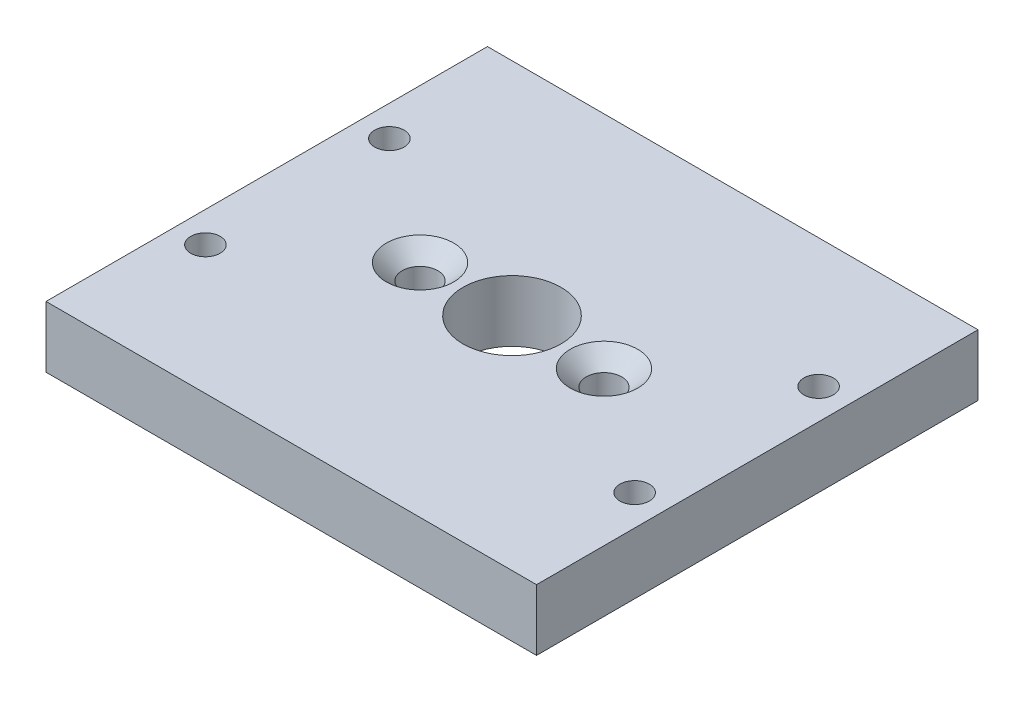
ISO-10303-21;
HEADER;
FILE_DESCRIPTION(('STEP AP214'),'2;1');
FILE_NAME('part.step','',(''),(''),'','','');
FILE_SCHEMA(('AUTOMOTIVE_DESIGN { 1 0 10303 214 1 1 1 1 }'));
ENDSEC;
DATA;
#1=APPLICATION_CONTEXT('core data for automotive mechanical design processes');
#2=APPLICATION_PROTOCOL_DEFINITION('international standard','automotive_design',2000,#1);
#3=PRODUCT_CONTEXT('',#1,'mechanical');
#4=PRODUCT('Part','Part','',(#3));
#5=PRODUCT_RELATED_PRODUCT_CATEGORY('part','',(#4));
#6=PRODUCT_DEFINITION_FORMATION('','',#4);
#7=PRODUCT_DEFINITION_CONTEXT('part definition',#1,'design');
#8=PRODUCT_DEFINITION('design','',#6,#7);
#9=PRODUCT_DEFINITION_SHAPE('','',#8);
#10=(LENGTH_UNIT() NAMED_UNIT(*) SI_UNIT(.MILLI.,.METRE.));
#11=(NAMED_UNIT(*) PLANE_ANGLE_UNIT() SI_UNIT($,.RADIAN.));
#12=(NAMED_UNIT(*) SI_UNIT($,.STERADIAN.) SOLID_ANGLE_UNIT());
#13=UNCERTAINTY_MEASURE_WITH_UNIT(LENGTH_MEASURE(1.E-05),#10,'distance_accuracy_value','');
#14=(GEOMETRIC_REPRESENTATION_CONTEXT(3) GLOBAL_UNCERTAINTY_ASSIGNED_CONTEXT((#13)) GLOBAL_UNIT_ASSIGNED_CONTEXT((#10,
#11,#12)) REPRESENTATION_CONTEXT('',''));
#15=CARTESIAN_POINT('',(0.,0.,0.));
#16=DIRECTION('',(0.,0.,1.));
#17=DIRECTION('',(1.,0.,0.));
#18=AXIS2_PLACEMENT_3D('',#15,#16,#17);
#19=CARTESIAN_POINT('',(0.,0.,0.));
#20=DIRECTION('',(0.,1.,0.));
#21=DIRECTION('',(0.,0.,1.));
#22=AXIS2_PLACEMENT_3D('',#19,#20,#21);
#23=PLANE('',#22);
#24=CARTESIAN_POINT('',(17.5,0.,7.5));
#25=DIRECTION('',(0.,-1.,0.));
#26=DIRECTION('',(0.,0.,-1.));
#27=AXIS2_PLACEMENT_3D('',#24,#25,#26);
#28=CIRCLE('',#27,2.2);
#29=CARTESIAN_POINT('',(17.5,0.,5.3));
#30=VERTEX_POINT('',#29);
#31=EDGE_CURVE('E168',#30,#30,#28,.T.);
#32=ORIENTED_EDGE('',*,*,#31,.F.);
#33=EDGE_LOOP('',(#32));
#34=FACE_BOUND('',#33,.T.);
#35=CARTESIAN_POINT('',(-7.5,0.,0.));
#36=DIRECTION('',(0.,1.,0.));
#37=DIRECTION('',(0.,0.,1.));
#38=AXIS2_PLACEMENT_3D('',#35,#36,#37);
#39=CIRCLE('',#38,1.45);
#40=CARTESIAN_POINT('',(-7.5,0.,1.45));
#41=VERTEX_POINT('',#40);
#42=EDGE_CURVE('E148',#41,#41,#39,.T.);
#43=ORIENTED_EDGE('',*,*,#42,.T.);
#44=EDGE_LOOP('',(#43));
#45=FACE_BOUND('',#44,.T.);
#46=CARTESIAN_POINT('',(7.5,0.,0.));
#47=DIRECTION('',(0.,1.,0.));
#48=DIRECTION('',(0.,0.,1.));
#49=AXIS2_PLACEMENT_3D('',#46,#47,#48);
#50=CIRCLE('',#49,1.45);
#51=CARTESIAN_POINT('',(7.5,0.,1.45));
#52=VERTEX_POINT('',#51);
#53=EDGE_CURVE('E133',#52,#52,#50,.T.);
#54=ORIENTED_EDGE('',*,*,#53,.T.);
#55=EDGE_LOOP('',(#54));
#56=FACE_BOUND('',#55,.T.);
#57=CARTESIAN_POINT('',(0.,0.,0.));
#58=DIRECTION('',(0.,1.,0.));
#59=DIRECTION('',(0.,0.,1.));
#60=AXIS2_PLACEMENT_3D('',#57,#58,#59);
#61=CIRCLE('',#60,4.);
#62=CARTESIAN_POINT('',(0.,0.,4.));
#63=VERTEX_POINT('',#62);
#64=EDGE_CURVE('E112',#63,#63,#61,.T.);
#65=ORIENTED_EDGE('',*,*,#64,.T.);
#66=EDGE_LOOP('',(#65));
#67=FACE_BOUND('',#66,.T.);
#68=DIRECTION('',(0.,0.,1.));
#69=VECTOR('',#68,1.);
#70=CARTESIAN_POINT('',(-20.,0.,18.));
#71=LINE('',#70,#69);
#72=CARTESIAN_POINT('',(-20.,0.,-18.));
#73=VERTEX_POINT('',#72);
#74=CARTESIAN_POINT('',(-20.,0.,18.));
#75=VERTEX_POINT('',#74);
#76=EDGE_CURVE('E108',#73,#75,#71,.T.);
#77=ORIENTED_EDGE('',*,*,#76,.F.);
#78=DIRECTION('',(-1.,0.,0.));
#79=VECTOR('',#78,1.);
#80=CARTESIAN_POINT('',(20.,0.,-18.));
#81=LINE('',#80,#79);
#82=CARTESIAN_POINT('',(20.,0.,-18.));
#83=VERTEX_POINT('',#82);
#84=EDGE_CURVE('E80',#83,#73,#81,.T.);
#85=ORIENTED_EDGE('',*,*,#84,.F.);
#86=DIRECTION('',(0.,0.,-1.));
#87=VECTOR('',#86,1.);
#88=CARTESIAN_POINT('',(20.,0.,18.));
#89=LINE('',#88,#87);
#90=CARTESIAN_POINT('',(20.,0.,18.));
#91=VERTEX_POINT('',#90);
#92=EDGE_CURVE('E74',#91,#83,#89,.T.);
#93=ORIENTED_EDGE('',*,*,#92,.F.);
#94=DIRECTION('',(1.,0.,0.));
#95=VECTOR('',#94,1.);
#96=CARTESIAN_POINT('',(20.,0.,18.));
#97=LINE('',#96,#95);
#98=EDGE_CURVE('E97',#75,#91,#97,.T.);
#99=ORIENTED_EDGE('',*,*,#98,.F.);
#100=EDGE_LOOP('',(#77,#85,#93,#99));
#101=FACE_BOUND('',#100,.T.);
#102=CARTESIAN_POINT('',(17.5,0.,-7.5));
#103=DIRECTION('',(0.,-1.,0.));
#104=DIRECTION('',(0.,0.,-1.));
#105=AXIS2_PLACEMENT_3D('',#102,#103,#104);
#106=CIRCLE('',#105,2.2);
#107=CARTESIAN_POINT('',(17.5,0.,-9.7));
#108=VERTEX_POINT('',#107);
#109=EDGE_CURVE('E180',#108,#108,#106,.T.);
#110=ORIENTED_EDGE('',*,*,#109,.F.);
#111=EDGE_LOOP('',(#110));
#112=FACE_BOUND('',#111,.T.);
#113=CARTESIAN_POINT('',(-17.5,0.,-7.5));
#114=DIRECTION('',(0.,-1.,0.));
#115=DIRECTION('',(0.,0.,-1.));
#116=AXIS2_PLACEMENT_3D('',#113,#114,#115);
#117=CIRCLE('',#116,2.2);
#118=CARTESIAN_POINT('',(-17.5,0.,-9.7));
#119=VERTEX_POINT('',#118);
#120=EDGE_CURVE('E192',#119,#119,#117,.T.);
#121=ORIENTED_EDGE('',*,*,#120,.F.);
#122=EDGE_LOOP('',(#121));
#123=FACE_BOUND('',#122,.T.);
#124=CARTESIAN_POINT('',(-17.5,0.,7.5));
#125=DIRECTION('',(0.,-1.,0.));
#126=DIRECTION('',(0.,0.,-1.));
#127=AXIS2_PLACEMENT_3D('',#124,#125,#126);
#128=CIRCLE('',#127,2.2);
#129=CARTESIAN_POINT('',(-17.5,0.,5.3));
#130=VERTEX_POINT('',#129);
#131=EDGE_CURVE('E204',#130,#130,#128,.T.);
#132=ORIENTED_EDGE('',*,*,#131,.F.);
#133=EDGE_LOOP('',(#132));
#134=FACE_BOUND('',#133,.T.);
#135=ADVANCED_FACE('F39',(#34,#45,#56,#67,#101,#112,#123,#134),#23,.F.);
#136=CARTESIAN_POINT('',(-20.,5.,18.));
#137=DIRECTION('',(1.,0.,0.));
#138=DIRECTION('',(0.,0.,-1.));
#139=AXIS2_PLACEMENT_3D('',#136,#137,#138);
#140=PLANE('',#139);
#141=ORIENTED_EDGE('',*,*,#76,.T.);
#142=DIRECTION('',(0.,-1.,0.));
#143=VECTOR('',#142,1.);
#144=CARTESIAN_POINT('',(-20.,5.,18.));
#145=LINE('',#144,#143);
#146=CARTESIAN_POINT('',(-20.,5.,18.));
#147=VERTEX_POINT('',#146);
#148=EDGE_CURVE('E11',#147,#75,#145,.T.);
#149=ORIENTED_EDGE('',*,*,#148,.F.);
#150=DIRECTION('',(0.,0.,1.));
#151=VECTOR('',#150,1.);
#152=CARTESIAN_POINT('',(-20.,5.,18.));
#153=LINE('',#152,#151);
#154=CARTESIAN_POINT('',(-20.,5.,-18.));
#155=VERTEX_POINT('',#154);
#156=EDGE_CURVE('E92',#155,#147,#153,.T.);
#157=ORIENTED_EDGE('',*,*,#156,.F.);
#158=DIRECTION('',(0.,-1.,0.));
#159=VECTOR('',#158,1.);
#160=CARTESIAN_POINT('',(-20.,5.,-18.));
#161=LINE('',#160,#159);
#162=EDGE_CURVE('E104',#155,#73,#161,.T.);
#163=ORIENTED_EDGE('',*,*,#162,.T.);
#164=EDGE_LOOP('',(#141,#149,#157,#163));
#165=FACE_BOUND('',#164,.T.);
#166=ADVANCED_FACE('F41',(#165),#140,.F.);
#167=CARTESIAN_POINT('',(20.,5.,18.));
#168=DIRECTION('',(0.,0.,-1.));
#169=DIRECTION('',(-1.,0.,0.));
#170=AXIS2_PLACEMENT_3D('',#167,#168,#169);
#171=PLANE('',#170);
#172=ORIENTED_EDGE('',*,*,#98,.T.);
#173=DIRECTION('',(0.,-1.,0.));
#174=VECTOR('',#173,1.);
#175=CARTESIAN_POINT('',(20.,5.,18.));
#176=LINE('',#175,#174);
#177=CARTESIAN_POINT('',(20.,5.,18.));
#178=VERTEX_POINT('',#177);
#179=EDGE_CURVE('E49',#178,#91,#176,.T.);
#180=ORIENTED_EDGE('',*,*,#179,.F.);
#181=DIRECTION('',(1.,0.,0.));
#182=VECTOR('',#181,1.);
#183=CARTESIAN_POINT('',(20.,5.,18.));
#184=LINE('',#183,#182);
#185=EDGE_CURVE('E87',#147,#178,#184,.T.);
#186=ORIENTED_EDGE('',*,*,#185,.F.);
#187=ORIENTED_EDGE('',*,*,#148,.T.);
#188=EDGE_LOOP('',(#172,#180,#186,#187));
#189=FACE_BOUND('',#188,.T.);
#190=ADVANCED_FACE('F96',(#189),#171,.F.);
#191=CARTESIAN_POINT('',(20.,5.,18.));
#192=DIRECTION('',(-1.,0.,0.));
#193=DIRECTION('',(0.,0.,1.));
#194=AXIS2_PLACEMENT_3D('',#191,#192,#193);
#195=PLANE('',#194);
#196=ORIENTED_EDGE('',*,*,#92,.T.);
#197=DIRECTION('',(0.,-1.,0.));
#198=VECTOR('',#197,1.);
#199=CARTESIAN_POINT('',(20.,5.,-18.));
#200=LINE('',#199,#198);
#201=CARTESIAN_POINT('',(20.,5.,-18.));
#202=VERTEX_POINT('',#201);
#203=EDGE_CURVE('E99',#202,#83,#200,.T.);
#204=ORIENTED_EDGE('',*,*,#203,.F.);
#205=DIRECTION('',(0.,0.,-1.));
#206=VECTOR('',#205,1.);
#207=CARTESIAN_POINT('',(20.,5.,18.));
#208=LINE('',#207,#206);
#209=EDGE_CURVE('E90',#178,#202,#208,.T.);
#210=ORIENTED_EDGE('',*,*,#209,.F.);
#211=ORIENTED_EDGE('',*,*,#179,.T.);
#212=EDGE_LOOP('',(#196,#204,#210,#211));
#213=FACE_BOUND('',#212,.T.);
#214=ADVANCED_FACE('F100',(#213),#195,.F.);
#215=CARTESIAN_POINT('',(20.,5.,-18.));
#216=DIRECTION('',(0.,0.,1.));
#217=DIRECTION('',(1.,0.,0.));
#218=AXIS2_PLACEMENT_3D('',#215,#216,#217);
#219=PLANE('',#218);
#220=ORIENTED_EDGE('',*,*,#84,.T.);
#221=ORIENTED_EDGE('',*,*,#162,.F.);
#222=DIRECTION('',(-1.,0.,0.));
#223=VECTOR('',#222,1.);
#224=CARTESIAN_POINT('',(20.,5.,-18.));
#225=LINE('',#224,#223);
#226=EDGE_CURVE('E57',#202,#155,#225,.T.);
#227=ORIENTED_EDGE('',*,*,#226,.F.);
#228=ORIENTED_EDGE('',*,*,#203,.T.);
#229=EDGE_LOOP('',(#220,#221,#227,#228));
#230=FACE_BOUND('',#229,.T.);
#231=ADVANCED_FACE('F122',(#230),#219,.F.);
#232=CARTESIAN_POINT('',(0.,5.,0.));
#233=DIRECTION('',(0.,1.,0.));
#234=DIRECTION('',(0.,0.,1.));
#235=AXIS2_PLACEMENT_3D('',#232,#233,#234);
#236=PLANE('',#235);
#237=CARTESIAN_POINT('',(-17.5,5.,7.5));
#238=DIRECTION('',(0.,1.,0.));
#239=DIRECTION('',(0.,0.,1.));
#240=AXIS2_PLACEMENT_3D('',#237,#238,#239);
#241=CIRCLE('',#240,1.2);
#242=CARTESIAN_POINT('',(-17.5,5.,8.7));
#243=VERTEX_POINT('',#242);
#244=EDGE_CURVE('E196',#243,#243,#241,.T.);
#245=ORIENTED_EDGE('',*,*,#244,.F.);
#246=EDGE_LOOP('',(#245));
#247=FACE_BOUND('',#246,.T.);
#248=CARTESIAN_POINT('',(-17.5,5.,-7.5));
#249=DIRECTION('',(0.,1.,0.));
#250=DIRECTION('',(0.,0.,1.));
#251=AXIS2_PLACEMENT_3D('',#248,#249,#250);
#252=CIRCLE('',#251,1.2);
#253=CARTESIAN_POINT('',(-17.5,5.,-6.3));
#254=VERTEX_POINT('',#253);
#255=EDGE_CURVE('E184',#254,#254,#252,.T.);
#256=ORIENTED_EDGE('',*,*,#255,.F.);
#257=EDGE_LOOP('',(#256));
#258=FACE_BOUND('',#257,.T.);
#259=CARTESIAN_POINT('',(17.5,5.,-7.5));
#260=DIRECTION('',(0.,1.,0.));
#261=DIRECTION('',(0.,0.,1.));
#262=AXIS2_PLACEMENT_3D('',#259,#260,#261);
#263=CIRCLE('',#262,1.2);
#264=CARTESIAN_POINT('',(17.5,5.,-6.3));
#265=VERTEX_POINT('',#264);
#266=EDGE_CURVE('E172',#265,#265,#263,.T.);
#267=ORIENTED_EDGE('',*,*,#266,.F.);
#268=EDGE_LOOP('',(#267));
#269=FACE_BOUND('',#268,.T.);
#270=CARTESIAN_POINT('',(17.5,5.,7.5));
#271=DIRECTION('',(0.,1.,0.));
#272=DIRECTION('',(0.,0.,1.));
#273=AXIS2_PLACEMENT_3D('',#270,#271,#272);
#274=CIRCLE('',#273,1.2);
#275=CARTESIAN_POINT('',(17.5,5.,8.7));
#276=VERTEX_POINT('',#275);
#277=EDGE_CURVE('E160',#276,#276,#274,.T.);
#278=ORIENTED_EDGE('',*,*,#277,.F.);
#279=EDGE_LOOP('',(#278));
#280=FACE_BOUND('',#279,.T.);
#281=CARTESIAN_POINT('',(-7.5,5.,0.));
#282=DIRECTION('',(0.,1.,0.));
#283=DIRECTION('',(0.,0.,1.));
#284=AXIS2_PLACEMENT_3D('',#281,#282,#283);
#285=CIRCLE('',#284,2.75);
#286=CARTESIAN_POINT('',(-7.5,5.,2.75));
#287=VERTEX_POINT('',#286);
#288=EDGE_CURVE('E156',#287,#287,#285,.T.);
#289=ORIENTED_EDGE('',*,*,#288,.F.);
#290=EDGE_LOOP('',(#289));
#291=FACE_BOUND('',#290,.T.);
#292=CARTESIAN_POINT('',(7.5,5.,0.));
#293=DIRECTION('',(0.,1.,0.));
#294=DIRECTION('',(0.,0.,1.));
#295=AXIS2_PLACEMENT_3D('',#292,#293,#294);
#296=CIRCLE('',#295,2.75);
#297=CARTESIAN_POINT('',(7.5,5.,2.75));
#298=VERTEX_POINT('',#297);
#299=EDGE_CURVE('E144',#298,#298,#296,.T.);
#300=ORIENTED_EDGE('',*,*,#299,.F.);
#301=EDGE_LOOP('',(#300));
#302=FACE_BOUND('',#301,.T.);
#303=CARTESIAN_POINT('',(0.,5.,0.));
#304=DIRECTION('',(0.,1.,0.));
#305=DIRECTION('',(0.,0.,1.));
#306=AXIS2_PLACEMENT_3D('',#303,#304,#305);
#307=CIRCLE('',#306,4.);
#308=CARTESIAN_POINT('',(0.,5.,4.));
#309=VERTEX_POINT('',#308);
#310=EDGE_CURVE('E129',#309,#309,#307,.T.);
#311=ORIENTED_EDGE('',*,*,#310,.F.);
#312=EDGE_LOOP('',(#311));
#313=FACE_BOUND('',#312,.T.);
#314=ORIENTED_EDGE('',*,*,#156,.T.);
#315=ORIENTED_EDGE('',*,*,#185,.T.);
#316=ORIENTED_EDGE('',*,*,#209,.T.);
#317=ORIENTED_EDGE('',*,*,#226,.T.);
#318=EDGE_LOOP('',(#314,#315,#316,#317));
#319=FACE_BOUND('',#318,.T.);
#320=ADVANCED_FACE('F88',(#247,#258,#269,#280,#291,#302,#313,#319),#236,.T.);
#321=CARTESIAN_POINT('',(0.,0.,0.));
#322=DIRECTION('',(0.,1.,0.));
#323=DIRECTION('',(0.,0.,1.));
#324=AXIS2_PLACEMENT_3D('',#321,#322,#323);
#325=CYLINDRICAL_SURFACE('',#324,4.);
#326=ORIENTED_EDGE('',*,*,#64,.F.);
#327=EDGE_LOOP('',(#326));
#328=FACE_BOUND('',#327,.T.);
#329=ORIENTED_EDGE('',*,*,#310,.T.);
#330=EDGE_LOOP('',(#329));
#331=FACE_BOUND('',#330,.T.);
#332=ADVANCED_FACE('F245',(#328,#331),#325,.F.);
#333=CARTESIAN_POINT('',(7.5,5.,0.));
#334=DIRECTION('',(0.,1.,0.));
#335=DIRECTION('',(0.,0.,1.));
#336=AXIS2_PLACEMENT_3D('',#333,#334,#335);
#337=CYLINDRICAL_SURFACE('',#336,1.45);
#338=ORIENTED_EDGE('',*,*,#53,.F.);
#339=EDGE_LOOP('',(#338));
#340=FACE_BOUND('',#339,.T.);
#341=CARTESIAN_POINT('',(7.5,3.7,0.));
#342=DIRECTION('',(0.,1.,0.));
#343=DIRECTION('',(0.,0.,1.));
#344=AXIS2_PLACEMENT_3D('',#341,#342,#343);
#345=CIRCLE('',#344,1.45);
#346=CARTESIAN_POINT('',(7.5,3.7,1.45));
#347=VERTEX_POINT('',#346);
#348=EDGE_CURVE('E140',#347,#347,#345,.T.);
#349=ORIENTED_EDGE('',*,*,#348,.T.);
#350=EDGE_LOOP('',(#349));
#351=FACE_BOUND('',#350,.T.);
#352=ADVANCED_FACE('F252',(#340,#351),#337,.F.);
#353=CARTESIAN_POINT('',(7.5,5.,0.));
#354=DIRECTION('',(0.,1.,0.));
#355=DIRECTION('',(0.,0.,1.));
#356=AXIS2_PLACEMENT_3D('',#353,#354,#355);
#357=CONICAL_SURFACE('',#356,2.75,0.785398163397449);
#358=ORIENTED_EDGE('',*,*,#348,.F.);
#359=EDGE_LOOP('',(#358));
#360=FACE_BOUND('',#359,.T.);
#361=ORIENTED_EDGE('',*,*,#299,.T.);
#362=EDGE_LOOP('',(#361));
#363=FACE_BOUND('',#362,.T.);
#364=ADVANCED_FACE('F259',(#360,#363),#357,.F.);
#365=CARTESIAN_POINT('',(-7.5,5.,0.));
#366=DIRECTION('',(0.,1.,0.));
#367=DIRECTION('',(0.,0.,1.));
#368=AXIS2_PLACEMENT_3D('',#365,#366,#367);
#369=CYLINDRICAL_SURFACE('',#368,1.45);
#370=ORIENTED_EDGE('',*,*,#42,.F.);
#371=EDGE_LOOP('',(#370));
#372=FACE_BOUND('',#371,.T.);
#373=CARTESIAN_POINT('',(-7.5,3.7,0.));
#374=DIRECTION('',(0.,1.,0.));
#375=DIRECTION('',(0.,0.,1.));
#376=AXIS2_PLACEMENT_3D('',#373,#374,#375);
#377=CIRCLE('',#376,1.45);
#378=CARTESIAN_POINT('',(-7.5,3.7,1.45));
#379=VERTEX_POINT('',#378);
#380=EDGE_CURVE('E152',#379,#379,#377,.T.);
#381=ORIENTED_EDGE('',*,*,#380,.T.);
#382=EDGE_LOOP('',(#381));
#383=FACE_BOUND('',#382,.T.);
#384=ADVANCED_FACE('F267',(#372,#383),#369,.F.);
#385=CARTESIAN_POINT('',(-7.5,5.,0.));
#386=DIRECTION('',(0.,1.,0.));
#387=DIRECTION('',(0.,0.,1.));
#388=AXIS2_PLACEMENT_3D('',#385,#386,#387);
#389=CONICAL_SURFACE('',#388,2.75,0.785398163397449);
#390=ORIENTED_EDGE('',*,*,#380,.F.);
#391=EDGE_LOOP('',(#390));
#392=FACE_BOUND('',#391,.T.);
#393=ORIENTED_EDGE('',*,*,#288,.T.);
#394=EDGE_LOOP('',(#393));
#395=FACE_BOUND('',#394,.T.);
#396=ADVANCED_FACE('F275',(#392,#395),#389,.F.);
#397=CARTESIAN_POINT('',(17.5,0.,7.5));
#398=DIRECTION('',(0.,-1.,0.));
#399=DIRECTION('',(0.,0.,-1.));
#400=AXIS2_PLACEMENT_3D('',#397,#398,#399);
#401=CYLINDRICAL_SURFACE('',#400,1.2);
#402=CARTESIAN_POINT('',(17.5,1.,7.5));
#403=DIRECTION('',(0.,-1.,0.));
#404=DIRECTION('',(0.,0.,-1.));
#405=AXIS2_PLACEMENT_3D('',#402,#403,#404);
#406=CIRCLE('',#405,1.2);
#407=CARTESIAN_POINT('',(17.5,1.,6.3));
#408=VERTEX_POINT('',#407);
#409=EDGE_CURVE('E164',#408,#408,#406,.T.);
#410=ORIENTED_EDGE('',*,*,#409,.T.);
#411=EDGE_LOOP('',(#410));
#412=FACE_BOUND('',#411,.T.);
#413=ORIENTED_EDGE('',*,*,#277,.T.);
#414=EDGE_LOOP('',(#413));
#415=FACE_BOUND('',#414,.T.);
#416=ADVANCED_FACE('F283',(#412,#415),#401,.F.);
#417=CARTESIAN_POINT('',(17.5,0.,7.5));
#418=DIRECTION('',(0.,-1.,0.));
#419=DIRECTION('',(0.,0.,-1.));
#420=AXIS2_PLACEMENT_3D('',#417,#418,#419);
#421=CONICAL_SURFACE('',#420,2.2,0.785398163397449);
#422=ORIENTED_EDGE('',*,*,#409,.F.);
#423=EDGE_LOOP('',(#422));
#424=FACE_BOUND('',#423,.T.);
#425=ORIENTED_EDGE('',*,*,#31,.T.);
#426=EDGE_LOOP('',(#425));
#427=FACE_BOUND('',#426,.T.);
#428=ADVANCED_FACE('F290',(#424,#427),#421,.F.);
#429=CARTESIAN_POINT('',(17.5,0.,-7.5));
#430=DIRECTION('',(0.,-1.,0.));
#431=DIRECTION('',(0.,0.,-1.));
#432=AXIS2_PLACEMENT_3D('',#429,#430,#431);
#433=CYLINDRICAL_SURFACE('',#432,1.2);
#434=CARTESIAN_POINT('',(17.5,1.,-7.5));
#435=DIRECTION('',(0.,-1.,0.));
#436=DIRECTION('',(0.,0.,-1.));
#437=AXIS2_PLACEMENT_3D('',#434,#435,#436);
#438=CIRCLE('',#437,1.2);
#439=CARTESIAN_POINT('',(17.5,1.,-8.7));
#440=VERTEX_POINT('',#439);
#441=EDGE_CURVE('E176',#440,#440,#438,.T.);
#442=ORIENTED_EDGE('',*,*,#441,.T.);
#443=EDGE_LOOP('',(#442));
#444=FACE_BOUND('',#443,.T.);
#445=ORIENTED_EDGE('',*,*,#266,.T.);
#446=EDGE_LOOP('',(#445));
#447=FACE_BOUND('',#446,.T.);
#448=ADVANCED_FACE('F298',(#444,#447),#433,.F.);
#449=CARTESIAN_POINT('',(17.5,0.,-7.5));
#450=DIRECTION('',(0.,-1.,0.));
#451=DIRECTION('',(0.,0.,-1.));
#452=AXIS2_PLACEMENT_3D('',#449,#450,#451);
#453=CONICAL_SURFACE('',#452,2.2,0.785398163397449);
#454=ORIENTED_EDGE('',*,*,#441,.F.);
#455=EDGE_LOOP('',(#454));
#456=FACE_BOUND('',#455,.T.);
#457=ORIENTED_EDGE('',*,*,#109,.T.);
#458=EDGE_LOOP('',(#457));
#459=FACE_BOUND('',#458,.T.);
#460=ADVANCED_FACE('F306',(#456,#459),#453,.F.);
#461=CARTESIAN_POINT('',(-17.5,0.,-7.5));
#462=DIRECTION('',(0.,-1.,0.));
#463=DIRECTION('',(0.,0.,-1.));
#464=AXIS2_PLACEMENT_3D('',#461,#462,#463);
#465=CYLINDRICAL_SURFACE('',#464,1.2);
#466=CARTESIAN_POINT('',(-17.5,1.,-7.5));
#467=DIRECTION('',(0.,-1.,0.));
#468=DIRECTION('',(0.,0.,-1.));
#469=AXIS2_PLACEMENT_3D('',#466,#467,#468);
#470=CIRCLE('',#469,1.2);
#471=CARTESIAN_POINT('',(-17.5,1.,-8.7));
#472=VERTEX_POINT('',#471);
#473=EDGE_CURVE('E188',#472,#472,#470,.T.);
#474=ORIENTED_EDGE('',*,*,#473,.T.);
#475=EDGE_LOOP('',(#474));
#476=FACE_BOUND('',#475,.T.);
#477=ORIENTED_EDGE('',*,*,#255,.T.);
#478=EDGE_LOOP('',(#477));
#479=FACE_BOUND('',#478,.T.);
#480=ADVANCED_FACE('F314',(#476,#479),#465,.F.);
#481=CARTESIAN_POINT('',(-17.5,0.,-7.5));
#482=DIRECTION('',(0.,-1.,0.));
#483=DIRECTION('',(0.,0.,-1.));
#484=AXIS2_PLACEMENT_3D('',#481,#482,#483);
#485=CONICAL_SURFACE('',#484,2.2,0.785398163397449);
#486=ORIENTED_EDGE('',*,*,#473,.F.);
#487=EDGE_LOOP('',(#486));
#488=FACE_BOUND('',#487,.T.);
#489=ORIENTED_EDGE('',*,*,#120,.T.);
#490=EDGE_LOOP('',(#489));
#491=FACE_BOUND('',#490,.T.);
#492=ADVANCED_FACE('F322',(#488,#491),#485,.F.);
#493=CARTESIAN_POINT('',(-17.5,0.,7.5));
#494=DIRECTION('',(0.,-1.,0.));
#495=DIRECTION('',(0.,0.,-1.));
#496=AXIS2_PLACEMENT_3D('',#493,#494,#495);
#497=CYLINDRICAL_SURFACE('',#496,1.2);
#498=CARTESIAN_POINT('',(-17.5,1.,7.5));
#499=DIRECTION('',(0.,-1.,0.));
#500=DIRECTION('',(0.,0.,-1.));
#501=AXIS2_PLACEMENT_3D('',#498,#499,#500);
#502=CIRCLE('',#501,1.2);
#503=CARTESIAN_POINT('',(-17.5,1.,6.3));
#504=VERTEX_POINT('',#503);
#505=EDGE_CURVE('E200',#504,#504,#502,.T.);
#506=ORIENTED_EDGE('',*,*,#505,.T.);
#507=EDGE_LOOP('',(#506));
#508=FACE_BOUND('',#507,.T.);
#509=ORIENTED_EDGE('',*,*,#244,.T.);
#510=EDGE_LOOP('',(#509));
#511=FACE_BOUND('',#510,.T.);
#512=ADVANCED_FACE('F330',(#508,#511),#497,.F.);
#513=CARTESIAN_POINT('',(-17.5,0.,7.5));
#514=DIRECTION('',(0.,-1.,0.));
#515=DIRECTION('',(0.,0.,-1.));
#516=AXIS2_PLACEMENT_3D('',#513,#514,#515);
#517=CONICAL_SURFACE('',#516,2.2,0.785398163397449);
#518=ORIENTED_EDGE('',*,*,#505,.F.);
#519=EDGE_LOOP('',(#518));
#520=FACE_BOUND('',#519,.T.);
#521=ORIENTED_EDGE('',*,*,#131,.T.);
#522=EDGE_LOOP('',(#521));
#523=FACE_BOUND('',#522,.T.);
#524=ADVANCED_FACE('F209',(#520,#523),#517,.F.);
#525=CLOSED_SHELL('',(#135,#166,#190,#214,#231,#320,#332,#352,#364,#384,#396,#416,#428,#448,
#460,#480,#492,#512,#524));
#526=MANIFOLD_SOLID_BREP('B2',#525);
#527=ADVANCED_BREP_SHAPE_REPRESENTATION('',(#18,#526),#14);
#528=SHAPE_DEFINITION_REPRESENTATION(#9,#527);
ENDSEC;
END-ISO-10303-21;
